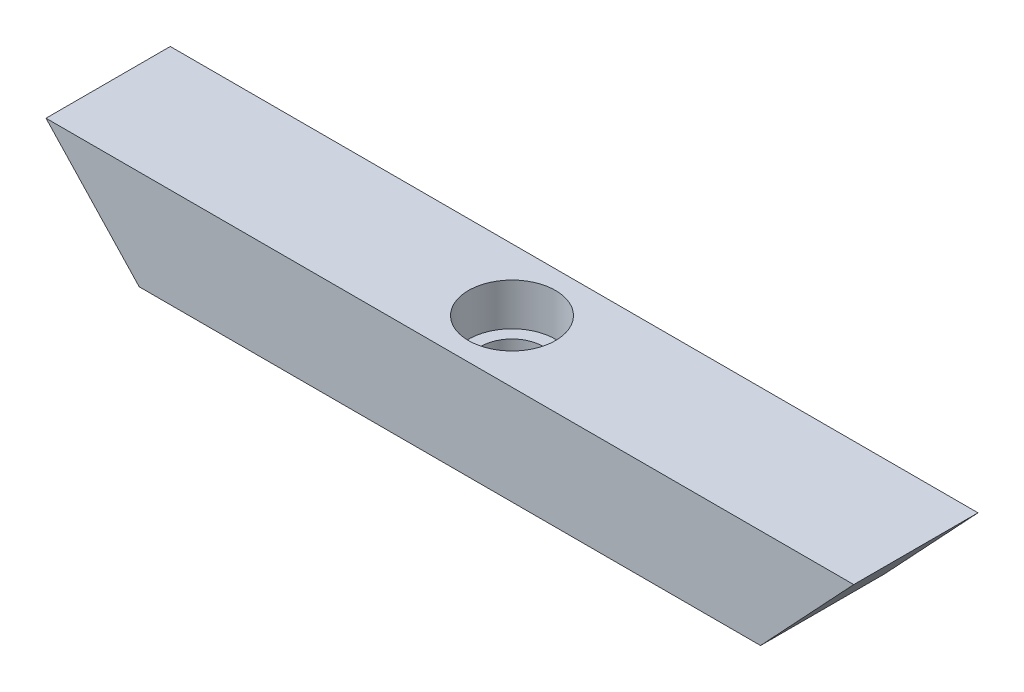
ISO-10303-21;
HEADER;
FILE_DESCRIPTION(('STEP AP214'),'2;1');
FILE_NAME('part.step','',(''),(''),'','','');
FILE_SCHEMA(('AUTOMOTIVE_DESIGN { 1 0 10303 214 1 1 1 1 }'));
ENDSEC;
DATA;
#1=APPLICATION_CONTEXT('core data for automotive mechanical design processes');
#2=APPLICATION_PROTOCOL_DEFINITION('international standard','automotive_design',2000,#1);
#3=PRODUCT_CONTEXT('',#1,'mechanical');
#4=PRODUCT('Part','Part','',(#3));
#5=PRODUCT_RELATED_PRODUCT_CATEGORY('part','',(#4));
#6=PRODUCT_DEFINITION_FORMATION('','',#4);
#7=PRODUCT_DEFINITION_CONTEXT('part definition',#1,'design');
#8=PRODUCT_DEFINITION('design','',#6,#7);
#9=PRODUCT_DEFINITION_SHAPE('','',#8);
#10=(LENGTH_UNIT() NAMED_UNIT(*) SI_UNIT(.MILLI.,.METRE.));
#11=(NAMED_UNIT(*) PLANE_ANGLE_UNIT() SI_UNIT($,.RADIAN.));
#12=(NAMED_UNIT(*) SI_UNIT($,.STERADIAN.) SOLID_ANGLE_UNIT());
#13=UNCERTAINTY_MEASURE_WITH_UNIT(LENGTH_MEASURE(1.E-05),#10,'distance_accuracy_value','');
#14=(GEOMETRIC_REPRESENTATION_CONTEXT(3) GLOBAL_UNCERTAINTY_ASSIGNED_CONTEXT((#13)) GLOBAL_UNIT_ASSIGNED_CONTEXT((#10,
#11,#12)) REPRESENTATION_CONTEXT('',''));
#15=CARTESIAN_POINT('',(0.,0.,0.));
#16=DIRECTION('',(0.,0.,1.));
#17=DIRECTION('',(1.,0.,0.));
#18=AXIS2_PLACEMENT_3D('',#15,#16,#17);
#19=CARTESIAN_POINT('',(0.,-40.001,25.));
#20=DIRECTION('',(0.,1.,0.));
#21=DIRECTION('',(0.,0.,1.));
#22=AXIS2_PLACEMENT_3D('',#19,#20,#21);
#23=CYLINDRICAL_SURFACE('',#22,17.5);
#24=CARTESIAN_POINT('',(0.,-40.,25.));
#25=DIRECTION('',(0.,1.,0.));
#26=DIRECTION('',(0.,0.,1.));
#27=AXIS2_PLACEMENT_3D('',#24,#25,#26);
#28=CIRCLE('',#27,17.5);
#29=CARTESIAN_POINT('',(0.,-40.,42.5));
#30=VERTEX_POINT('',#29);
#31=EDGE_CURVE('E103',#30,#30,#28,.F.);
#32=ORIENTED_EDGE('',*,*,#31,.T.);
#33=EDGE_LOOP('',(#32));
#34=FACE_BOUND('',#33,.T.);
#35=CARTESIAN_POINT('',(0.,-23.,25.));
#36=DIRECTION('',(0.,1.,0.));
#37=DIRECTION('',(0.,0.,1.));
#38=AXIS2_PLACEMENT_3D('',#35,#36,#37);
#39=CIRCLE('',#38,17.5);
#40=CARTESIAN_POINT('',(0.,-23.,42.5));
#41=VERTEX_POINT('',#40);
#42=EDGE_CURVE('E11',#41,#41,#39,.F.);
#43=ORIENTED_EDGE('',*,*,#42,.F.);
#44=EDGE_LOOP('',(#43));
#45=FACE_BOUND('',#44,.T.);
#46=ADVANCED_FACE('F33',(#34,#45),#23,.F.);
#47=CARTESIAN_POINT('',(162.5,0.,50.));
#48=DIRECTION('',(-0.729537204140085,0.68394112888133,0.));
#49=DIRECTION('',(-0.68394112888133,-0.729537204140085,0.));
#50=AXIS2_PLACEMENT_3D('',#47,#48,#49);
#51=PLANE('',#50);
#52=DIRECTION('',(0.683941128881329,0.729537204140085,0.));
#53=VECTOR('',#52,1.);
#54=CARTESIAN_POINT('',(162.5,0.,0.));
#55=LINE('',#54,#53);
#56=CARTESIAN_POINT('',(125.,-40.,0.));
#57=VERTEX_POINT('',#56);
#58=CARTESIAN_POINT('',(162.5,0.,0.));
#59=VERTEX_POINT('',#58);
#60=EDGE_CURVE('E100',#57,#59,#55,.T.);
#61=ORIENTED_EDGE('',*,*,#60,.T.);
#62=DIRECTION('',(0.,0.,-1.));
#63=VECTOR('',#62,1.);
#64=CARTESIAN_POINT('',(162.5,0.,50.));
#65=LINE('',#64,#63);
#66=CARTESIAN_POINT('',(162.5,0.,50.));
#67=VERTEX_POINT('',#66);
#68=EDGE_CURVE('E42',#67,#59,#65,.T.);
#69=ORIENTED_EDGE('',*,*,#68,.F.);
#70=DIRECTION('',(0.683941128881329,0.729537204140085,0.));
#71=VECTOR('',#70,1.);
#72=CARTESIAN_POINT('',(162.5,0.,50.));
#73=LINE('',#72,#71);
#74=CARTESIAN_POINT('',(125.,-40.,50.));
#75=VERTEX_POINT('',#74);
#76=EDGE_CURVE('E86',#75,#67,#73,.T.);
#77=ORIENTED_EDGE('',*,*,#76,.F.);
#78=DIRECTION('',(0.,0.,-1.));
#79=VECTOR('',#78,1.);
#80=CARTESIAN_POINT('',(125.,-40.,50.));
#81=LINE('',#80,#79);
#82=EDGE_CURVE('E96',#75,#57,#81,.T.);
#83=ORIENTED_EDGE('',*,*,#82,.T.);
#84=EDGE_LOOP('',(#61,#69,#77,#83));
#85=FACE_BOUND('',#84,.T.);
#86=ADVANCED_FACE('F35',(#85),#51,.F.);
#87=CARTESIAN_POINT('',(-162.5,0.,50.));
#88=DIRECTION('',(0.,-1.,0.));
#89=DIRECTION('',(0.,0.,-1.));
#90=AXIS2_PLACEMENT_3D('',#87,#88,#89);
#91=PLANE('',#90);
#92=CARTESIAN_POINT('',(0.,0.,25.));
#93=DIRECTION('',(0.,1.,0.));
#94=DIRECTION('',(0.,0.,1.));
#95=AXIS2_PLACEMENT_3D('',#92,#93,#94);
#96=CIRCLE('',#95,17.5);
#97=CARTESIAN_POINT('',(0.,0.,42.5));
#98=VERTEX_POINT('',#97);
#99=EDGE_CURVE('E159',#98,#98,#96,.T.);
#100=ORIENTED_EDGE('',*,*,#99,.F.);
#101=EDGE_LOOP('',(#100));
#102=FACE_BOUND('',#101,.T.);
#103=DIRECTION('',(-1.,0.,0.));
#104=VECTOR('',#103,1.);
#105=CARTESIAN_POINT('',(-162.5,0.,0.));
#106=LINE('',#105,#104);
#107=CARTESIAN_POINT('',(-162.5,0.,0.));
#108=VERTEX_POINT('',#107);
#109=EDGE_CURVE('E91',#59,#108,#106,.T.);
#110=ORIENTED_EDGE('',*,*,#109,.T.);
#111=DIRECTION('',(0.,0.,-1.));
#112=VECTOR('',#111,1.);
#113=CARTESIAN_POINT('',(-162.5,0.,50.));
#114=LINE('',#113,#112);
#115=CARTESIAN_POINT('',(-162.5,0.,50.));
#116=VERTEX_POINT('',#115);
#117=EDGE_CURVE('E89',#116,#108,#114,.T.);
#118=ORIENTED_EDGE('',*,*,#117,.F.);
#119=DIRECTION('',(-1.,0.,0.));
#120=VECTOR('',#119,1.);
#121=CARTESIAN_POINT('',(-162.5,0.,50.));
#122=LINE('',#121,#120);
#123=EDGE_CURVE('E81',#67,#116,#122,.T.);
#124=ORIENTED_EDGE('',*,*,#123,.F.);
#125=ORIENTED_EDGE('',*,*,#68,.T.);
#126=EDGE_LOOP('',(#110,#118,#124,#125));
#127=FACE_BOUND('',#126,.T.);
#128=ADVANCED_FACE('F90',(#102,#127),#91,.F.);
#129=CARTESIAN_POINT('',(-162.5,0.,50.));
#130=DIRECTION('',(0.729537204140085,0.68394112888133,0.));
#131=DIRECTION('',(-0.68394112888133,0.729537204140085,0.));
#132=AXIS2_PLACEMENT_3D('',#129,#130,#131);
#133=PLANE('',#132);
#134=DIRECTION('',(0.683941128881329,-0.729537204140085,0.));
#135=VECTOR('',#134,1.);
#136=CARTESIAN_POINT('',(-162.5,0.,0.));
#137=LINE('',#136,#135);
#138=CARTESIAN_POINT('',(-125.,-40.,0.));
#139=VERTEX_POINT('',#138);
#140=EDGE_CURVE('E67',#108,#139,#137,.T.);
#141=ORIENTED_EDGE('',*,*,#140,.T.);
#142=DIRECTION('',(0.,0.,-1.));
#143=VECTOR('',#142,1.);
#144=CARTESIAN_POINT('',(-125.,-40.,50.));
#145=LINE('',#144,#143);
#146=CARTESIAN_POINT('',(-125.,-40.,50.));
#147=VERTEX_POINT('',#146);
#148=EDGE_CURVE('E92',#147,#139,#145,.T.);
#149=ORIENTED_EDGE('',*,*,#148,.F.);
#150=DIRECTION('',(0.683941128881329,-0.729537204140085,0.));
#151=VECTOR('',#150,1.);
#152=CARTESIAN_POINT('',(-162.5,0.,50.));
#153=LINE('',#152,#151);
#154=EDGE_CURVE('E84',#116,#147,#153,.T.);
#155=ORIENTED_EDGE('',*,*,#154,.F.);
#156=ORIENTED_EDGE('',*,*,#117,.T.);
#157=EDGE_LOOP('',(#141,#149,#155,#156));
#158=FACE_BOUND('',#157,.T.);
#159=ADVANCED_FACE('F94',(#158),#133,.F.);
#160=CARTESIAN_POINT('',(125.,-40.,50.));
#161=DIRECTION('',(0.,1.,0.));
#162=DIRECTION('',(0.,0.,1.));
#163=AXIS2_PLACEMENT_3D('',#160,#161,#162);
#164=PLANE('',#163);
#165=ORIENTED_EDGE('',*,*,#31,.F.);
#166=EDGE_LOOP('',(#165));
#167=FACE_BOUND('',#166,.T.);
#168=DIRECTION('',(1.,0.,0.));
#169=VECTOR('',#168,1.);
#170=CARTESIAN_POINT('',(125.,-40.,0.));
#171=LINE('',#170,#169);
#172=EDGE_CURVE('E73',#139,#57,#171,.T.);
#173=ORIENTED_EDGE('',*,*,#172,.T.);
#174=ORIENTED_EDGE('',*,*,#82,.F.);
#175=DIRECTION('',(1.,0.,0.));
#176=VECTOR('',#175,1.);
#177=CARTESIAN_POINT('',(125.,-40.,50.));
#178=LINE('',#177,#176);
#179=EDGE_CURVE('E50',#147,#75,#178,.T.);
#180=ORIENTED_EDGE('',*,*,#179,.F.);
#181=ORIENTED_EDGE('',*,*,#148,.T.);
#182=EDGE_LOOP('',(#173,#174,#180,#181));
#183=FACE_BOUND('',#182,.T.);
#184=ADVANCED_FACE('F122',(#167,#183),#164,.F.);
#185=CARTESIAN_POINT('',(0.,0.,50.));
#186=DIRECTION('',(0.,0.,1.));
#187=DIRECTION('',(1.,0.,0.));
#188=AXIS2_PLACEMENT_3D('',#185,#186,#187);
#189=PLANE('',#188);
#190=ORIENTED_EDGE('',*,*,#76,.T.);
#191=ORIENTED_EDGE('',*,*,#123,.T.);
#192=ORIENTED_EDGE('',*,*,#154,.T.);
#193=ORIENTED_EDGE('',*,*,#179,.T.);
#194=EDGE_LOOP('',(#190,#191,#192,#193));
#195=FACE_BOUND('',#194,.T.);
#196=ADVANCED_FACE('F82',(#195),#189,.T.);
#197=CARTESIAN_POINT('',(0.,0.,0.));
#198=DIRECTION('',(0.,0.,1.));
#199=DIRECTION('',(1.,0.,0.));
#200=AXIS2_PLACEMENT_3D('',#197,#198,#199);
#201=PLANE('',#200);
#202=ORIENTED_EDGE('',*,*,#60,.F.);
#203=ORIENTED_EDGE('',*,*,#172,.F.);
#204=ORIENTED_EDGE('',*,*,#140,.F.);
#205=ORIENTED_EDGE('',*,*,#109,.F.);
#206=EDGE_LOOP('',(#202,#203,#204,#205));
#207=FACE_BOUND('',#206,.T.);
#208=ADVANCED_FACE('F111',(#207),#201,.F.);
#209=CARTESIAN_POINT('',(0.,-17.,25.));
#210=DIRECTION('',(0.,1.,0.));
#211=DIRECTION('',(0.,0.,1.));
#212=AXIS2_PLACEMENT_3D('',#209,#210,#211);
#213=CIRCLE('',#212,17.5);
#214=CARTESIAN_POINT('',(0.,-17.,42.5));
#215=VERTEX_POINT('',#214);
#216=EDGE_CURVE('E148',#215,#215,#213,.T.);
#217=ORIENTED_EDGE('',*,*,#216,.F.);
#218=EDGE_LOOP('',(#217));
#219=FACE_BOUND('',#218,.T.);
#220=ORIENTED_EDGE('',*,*,#99,.T.);
#221=EDGE_LOOP('',(#220));
#222=FACE_BOUND('',#221,.T.);
#223=ADVANCED_FACE('F113',(#219,#222),#23,.F.);
#224=CARTESIAN_POINT('',(0.,-23.,25.));
#225=DIRECTION('',(0.,1.,0.));
#226=DIRECTION('',(0.,0.,1.));
#227=AXIS2_PLACEMENT_3D('',#224,#225,#226);
#228=PLANE('',#227);
#229=CARTESIAN_POINT('',(0.,-23.,25.));
#230=DIRECTION('',(0.,1.,0.));
#231=DIRECTION('',(0.,0.,1.));
#232=AXIS2_PLACEMENT_3D('',#229,#230,#231);
#233=CIRCLE('',#232,12.5);
#234=CARTESIAN_POINT('',(0.,-23.,37.5));
#235=VERTEX_POINT('',#234);
#236=EDGE_CURVE('E154',#235,#235,#233,.T.);
#237=ORIENTED_EDGE('',*,*,#236,.T.);
#238=EDGE_LOOP('',(#237));
#239=FACE_BOUND('',#238,.T.);
#240=ORIENTED_EDGE('',*,*,#42,.T.);
#241=EDGE_LOOP('',(#240));
#242=FACE_BOUND('',#241,.T.);
#243=ADVANCED_FACE('F119',(#239,#242),#228,.F.);
#244=CARTESIAN_POINT('',(0.,-23.,25.));
#245=DIRECTION('',(0.,1.,0.));
#246=DIRECTION('',(0.,0.,1.));
#247=AXIS2_PLACEMENT_3D('',#244,#245,#246);
#248=CYLINDRICAL_SURFACE('',#247,12.5);
#249=ORIENTED_EDGE('',*,*,#236,.F.);
#250=EDGE_LOOP('',(#249));
#251=FACE_BOUND('',#250,.T.);
#252=CARTESIAN_POINT('',(0.,-17.,25.));
#253=DIRECTION('',(0.,1.,0.));
#254=DIRECTION('',(0.,0.,1.));
#255=AXIS2_PLACEMENT_3D('',#252,#253,#254);
#256=CIRCLE('',#255,12.5);
#257=CARTESIAN_POINT('',(0.,-17.,37.5));
#258=VERTEX_POINT('',#257);
#259=EDGE_CURVE('E151',#258,#258,#256,.T.);
#260=ORIENTED_EDGE('',*,*,#259,.T.);
#261=EDGE_LOOP('',(#260));
#262=FACE_BOUND('',#261,.T.);
#263=ADVANCED_FACE('F135',(#251,#262),#248,.F.);
#264=CARTESIAN_POINT('',(0.,-17.,25.));
#265=DIRECTION('',(0.,1.,0.));
#266=DIRECTION('',(0.,0.,1.));
#267=AXIS2_PLACEMENT_3D('',#264,#265,#266);
#268=PLANE('',#267);
#269=ORIENTED_EDGE('',*,*,#216,.T.);
#270=EDGE_LOOP('',(#269));
#271=FACE_BOUND('',#270,.T.);
#272=ORIENTED_EDGE('',*,*,#259,.F.);
#273=EDGE_LOOP('',(#272));
#274=FACE_BOUND('',#273,.T.);
#275=ADVANCED_FACE('F139',(#271,#274),#268,.T.);
#276=CLOSED_SHELL('',(#46,#86,#128,#159,#184,#196,#208,#223,#243,#263,#275));
#277=MANIFOLD_SOLID_BREP('B2',#276);
#278=ADVANCED_BREP_SHAPE_REPRESENTATION('',(#18,#277),#14);
#279=SHAPE_DEFINITION_REPRESENTATION(#9,#278);
ENDSEC;
END-ISO-10303-21;
